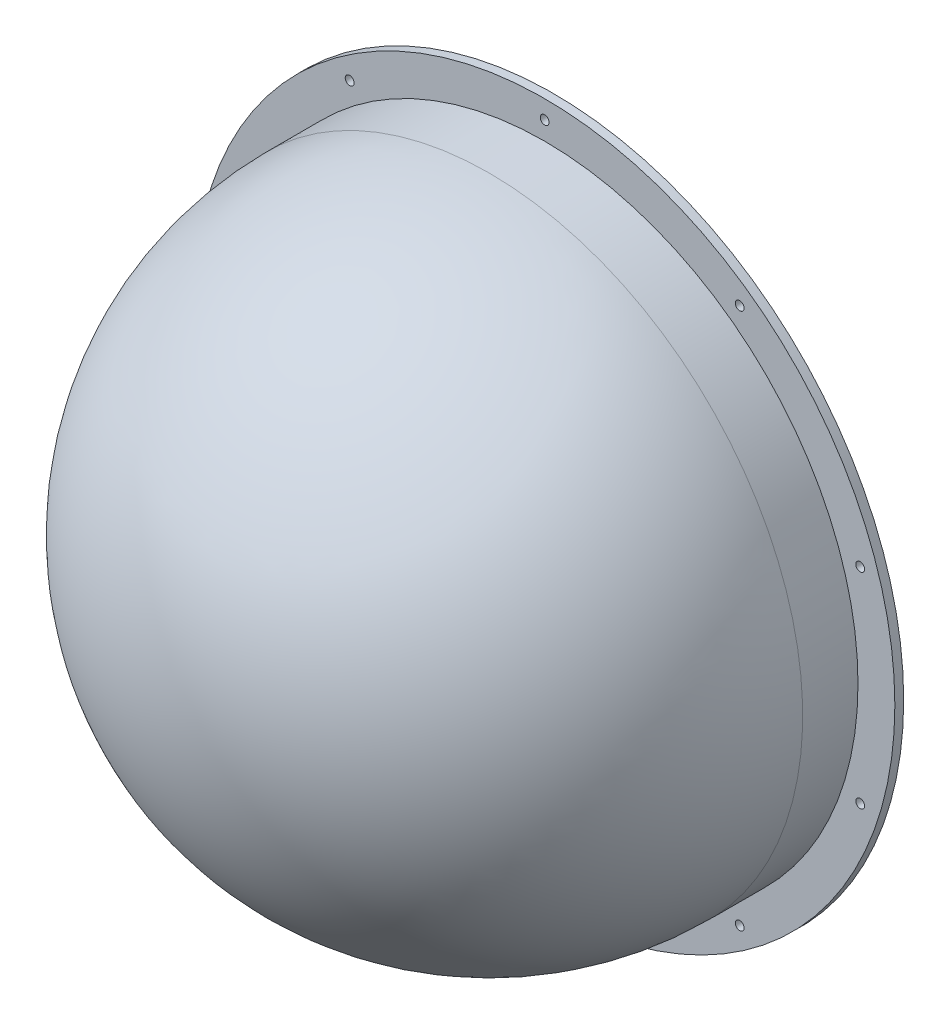
ISO-10303-21;
HEADER;
FILE_DESCRIPTION(('STEP AP214'),'2;1');
FILE_NAME('part.step','',(''),(''),'','','');
FILE_SCHEMA(('AUTOMOTIVE_DESIGN { 1 0 10303 214 1 1 1 1 }'));
ENDSEC;
DATA;
#1=APPLICATION_CONTEXT('core data for automotive mechanical design processes');
#2=APPLICATION_PROTOCOL_DEFINITION('international standard','automotive_design',2000,#1);
#3=PRODUCT_CONTEXT('',#1,'mechanical');
#4=PRODUCT('Part','Part','',(#3));
#5=PRODUCT_RELATED_PRODUCT_CATEGORY('part','',(#4));
#6=PRODUCT_DEFINITION_FORMATION('','',#4);
#7=PRODUCT_DEFINITION_CONTEXT('part definition',#1,'design');
#8=PRODUCT_DEFINITION('design','',#6,#7);
#9=PRODUCT_DEFINITION_SHAPE('','',#8);
#10=(LENGTH_UNIT() NAMED_UNIT(*) SI_UNIT(.MILLI.,.METRE.));
#11=(NAMED_UNIT(*) PLANE_ANGLE_UNIT() SI_UNIT($,.RADIAN.));
#12=(NAMED_UNIT(*) SI_UNIT($,.STERADIAN.) SOLID_ANGLE_UNIT());
#13=UNCERTAINTY_MEASURE_WITH_UNIT(LENGTH_MEASURE(1.E-05),#10,'distance_accuracy_value','');
#14=(GEOMETRIC_REPRESENTATION_CONTEXT(3) GLOBAL_UNCERTAINTY_ASSIGNED_CONTEXT((#13)) GLOBAL_UNIT_ASSIGNED_CONTEXT((#10,
#11,#12)) REPRESENTATION_CONTEXT('',''));
#15=CARTESIAN_POINT('',(0.,0.,0.));
#16=DIRECTION('',(0.,0.,1.));
#17=DIRECTION('',(1.,0.,0.));
#18=AXIS2_PLACEMENT_3D('',#15,#16,#17);
#19=CARTESIAN_POINT('',(0.,0.,12.));
#20=DIRECTION('',(0.,0.,1.));
#21=DIRECTION('',(1.,0.,0.));
#22=AXIS2_PLACEMENT_3D('',#19,#20,#21);
#23=PLANE('',#22);
#24=CARTESIAN_POINT('',(0.,0.,12.));
#25=DIRECTION('',(0.,0.,1.));
#26=DIRECTION('',(1.,0.,0.));
#27=AXIS2_PLACEMENT_3D('',#24,#25,#26);
#28=CIRCLE('',#27,425.);
#29=CARTESIAN_POINT('',(425.,0.,12.));
#30=VERTEX_POINT('',#29);
#31=EDGE_CURVE('E10',#30,#30,#28,.T.);
#32=ORIENTED_EDGE('',*,*,#31,.F.);
#33=EDGE_LOOP('',(#32));
#34=FACE_BOUND('',#33,.T.);
#35=CARTESIAN_POINT('',(-427.975432332819,139.057647468726,12.));
#36=DIRECTION('',(0.,0.,1.));
#37=DIRECTION('',(1.,0.,0.));
#38=AXIS2_PLACEMENT_3D('',#35,#36,#37);
#39=CIRCLE('',#38,5.99999999999999);
#40=CARTESIAN_POINT('',(-421.975432332819,139.057647468726,12.));
#41=VERTEX_POINT('',#40);
#42=EDGE_CURVE('E98',#41,#41,#39,.T.);
#43=ORIENTED_EDGE('',*,*,#42,.F.);
#44=EDGE_LOOP('',(#43));
#45=FACE_BOUND('',#44,.T.);
#46=CARTESIAN_POINT('',(-264.503363531613,-364.057647468727,12.));
#47=DIRECTION('',(0.,0.,1.));
#48=DIRECTION('',(1.,0.,0.));
#49=AXIS2_PLACEMENT_3D('',#46,#47,#48);
#50=CIRCLE('',#49,5.99999999999999);
#51=CARTESIAN_POINT('',(-258.503363531613,-364.057647468727,12.));
#52=VERTEX_POINT('',#51);
#53=EDGE_CURVE('E86',#52,#52,#50,.T.);
#54=ORIENTED_EDGE('',*,*,#53,.F.);
#55=EDGE_LOOP('',(#54));
#56=FACE_BOUND('',#55,.T.);
#57=CARTESIAN_POINT('',(264.503363531613,-364.057647468727,12.));
#58=DIRECTION('',(0.,0.,1.));
#59=DIRECTION('',(1.,0.,0.));
#60=AXIS2_PLACEMENT_3D('',#57,#58,#59);
#61=CIRCLE('',#60,5.99999999999999);
#62=CARTESIAN_POINT('',(270.503363531613,-364.057647468727,12.));
#63=VERTEX_POINT('',#62);
#64=EDGE_CURVE('E74',#63,#63,#61,.T.);
#65=ORIENTED_EDGE('',*,*,#64,.F.);
#66=EDGE_LOOP('',(#65));
#67=FACE_BOUND('',#66,.T.);
#68=CARTESIAN_POINT('',(427.975432332819,139.057647468726,12.));
#69=DIRECTION('',(0.,0.,1.));
#70=DIRECTION('',(1.,0.,0.));
#71=AXIS2_PLACEMENT_3D('',#68,#69,#70);
#72=CIRCLE('',#71,5.99999999999999);
#73=CARTESIAN_POINT('',(433.975432332819,139.057647468726,12.));
#74=VERTEX_POINT('',#73);
#75=EDGE_CURVE('E62',#74,#74,#72,.T.);
#76=ORIENTED_EDGE('',*,*,#75,.F.);
#77=EDGE_LOOP('',(#76));
#78=FACE_BOUND('',#77,.T.);
#79=CARTESIAN_POINT('',(0.,0.,12.));
#80=DIRECTION('',(0.,0.,1.));
#81=DIRECTION('',(1.,0.,0.));
#82=AXIS2_PLACEMENT_3D('',#79,#80,#81);
#83=CIRCLE('',#82,475.);
#84=CARTESIAN_POINT('',(475.,0.,12.));
#85=VERTEX_POINT('',#84);
#86=EDGE_CURVE('E39',#85,#85,#83,.T.);
#87=ORIENTED_EDGE('',*,*,#86,.T.);
#88=EDGE_LOOP('',(#87));
#89=FACE_BOUND('',#88,.T.);
#90=CARTESIAN_POINT('',(0.,450.,12.));
#91=DIRECTION('',(0.,0.,1.));
#92=DIRECTION('',(1.,0.,0.));
#93=AXIS2_PLACEMENT_3D('',#90,#91,#92);
#94=CIRCLE('',#93,6.00000000000001);
#95=CARTESIAN_POINT('',(6.00000000000001,450.,12.));
#96=VERTEX_POINT('',#95);
#97=EDGE_CURVE('E48',#96,#96,#94,.T.);
#98=ORIENTED_EDGE('',*,*,#97,.F.);
#99=EDGE_LOOP('',(#98));
#100=FACE_BOUND('',#99,.T.);
#101=CARTESIAN_POINT('',(264.503363531613,364.057647468726,12.));
#102=DIRECTION('',(0.,0.,1.));
#103=DIRECTION('',(1.,0.,0.));
#104=AXIS2_PLACEMENT_3D('',#101,#102,#103);
#105=CIRCLE('',#104,5.99999999999999);
#106=CARTESIAN_POINT('',(270.503363531613,364.057647468726,12.));
#107=VERTEX_POINT('',#106);
#108=EDGE_CURVE('E58',#107,#107,#105,.T.);
#109=ORIENTED_EDGE('',*,*,#108,.F.);
#110=EDGE_LOOP('',(#109));
#111=FACE_BOUND('',#110,.T.);
#112=CARTESIAN_POINT('',(427.97543233282,-139.057647468727,12.));
#113=DIRECTION('',(0.,0.,1.));
#114=DIRECTION('',(1.,0.,0.));
#115=AXIS2_PLACEMENT_3D('',#112,#113,#114);
#116=CIRCLE('',#115,5.99999999999999);
#117=CARTESIAN_POINT('',(433.97543233282,-139.057647468727,12.));
#118=VERTEX_POINT('',#117);
#119=EDGE_CURVE('E68',#118,#118,#116,.T.);
#120=ORIENTED_EDGE('',*,*,#119,.F.);
#121=EDGE_LOOP('',(#120));
#122=FACE_BOUND('',#121,.T.);
#123=CARTESIAN_POINT('',(2.59383141282199E-13,-450.000000000001,12.));
#124=DIRECTION('',(0.,0.,1.));
#125=DIRECTION('',(1.,0.,0.));
#126=AXIS2_PLACEMENT_3D('',#123,#124,#125);
#127=CIRCLE('',#126,6.00000000000001);
#128=CARTESIAN_POINT('',(6.00000000000027,-450.000000000001,12.));
#129=VERTEX_POINT('',#128);
#130=EDGE_CURVE('E80',#129,#129,#127,.T.);
#131=ORIENTED_EDGE('',*,*,#130,.F.);
#132=EDGE_LOOP('',(#131));
#133=FACE_BOUND('',#132,.T.);
#134=CARTESIAN_POINT('',(-427.975432332819,-139.057647468727,12.));
#135=DIRECTION('',(0.,0.,1.));
#136=DIRECTION('',(1.,0.,0.));
#137=AXIS2_PLACEMENT_3D('',#134,#135,#136);
#138=CIRCLE('',#137,5.99999999999999);
#139=CARTESIAN_POINT('',(-421.975432332819,-139.057647468727,12.));
#140=VERTEX_POINT('',#139);
#141=EDGE_CURVE('E92',#140,#140,#138,.T.);
#142=ORIENTED_EDGE('',*,*,#141,.F.);
#143=EDGE_LOOP('',(#142));
#144=FACE_BOUND('',#143,.T.);
#145=CARTESIAN_POINT('',(-264.503363531613,364.057647468726,12.));
#146=DIRECTION('',(0.,0.,1.));
#147=DIRECTION('',(1.,0.,0.));
#148=AXIS2_PLACEMENT_3D('',#145,#146,#147);
#149=CIRCLE('',#148,5.99999999999999);
#150=CARTESIAN_POINT('',(-258.503363531613,364.057647468726,12.));
#151=VERTEX_POINT('',#150);
#152=EDGE_CURVE('E104',#151,#151,#149,.T.);
#153=ORIENTED_EDGE('',*,*,#152,.F.);
#154=EDGE_LOOP('',(#153));
#155=FACE_BOUND('',#154,.T.);
#156=ADVANCED_FACE('F32',(#34,#45,#56,#67,#78,#89,#100,#111,#122,#133,#144,#155),#23,.T.);
#157=CARTESIAN_POINT('',(0.,0.,0.));
#158=DIRECTION('',(0.,0.,1.));
#159=DIRECTION('',(1.,0.,0.));
#160=AXIS2_PLACEMENT_3D('',#157,#158,#159);
#161=PLANE('',#160);
#162=CARTESIAN_POINT('',(0.,0.,0.));
#163=DIRECTION('',(0.,0.,1.));
#164=DIRECTION('',(1.,0.,0.));
#165=AXIS2_PLACEMENT_3D('',#162,#163,#164);
#166=CIRCLE('',#165,475.);
#167=CARTESIAN_POINT('',(475.,0.,0.));
#168=VERTEX_POINT('',#167);
#169=EDGE_CURVE('E43',#168,#168,#166,.T.);
#170=ORIENTED_EDGE('',*,*,#169,.F.);
#171=EDGE_LOOP('',(#170));
#172=FACE_BOUND('',#171,.T.);
#173=CARTESIAN_POINT('',(0.,450.,0.));
#174=DIRECTION('',(0.,0.,1.));
#175=DIRECTION('',(1.,0.,0.));
#176=AXIS2_PLACEMENT_3D('',#173,#174,#175);
#177=CIRCLE('',#176,6.00000000000001);
#178=CARTESIAN_POINT('',(6.00000000000001,450.,0.));
#179=VERTEX_POINT('',#178);
#180=EDGE_CURVE('E50',#179,#179,#177,.T.);
#181=ORIENTED_EDGE('',*,*,#180,.T.);
#182=EDGE_LOOP('',(#181));
#183=FACE_BOUND('',#182,.T.);
#184=CARTESIAN_POINT('',(0.,0.,0.));
#185=DIRECTION('',(0.,0.,1.));
#186=DIRECTION('',(1.,0.,0.));
#187=AXIS2_PLACEMENT_3D('',#184,#185,#186);
#188=CIRCLE('',#187,419.);
#189=CARTESIAN_POINT('',(419.,0.,0.));
#190=VERTEX_POINT('',#189);
#191=EDGE_CURVE('E53',#190,#190,#188,.T.);
#192=ORIENTED_EDGE('',*,*,#191,.T.);
#193=EDGE_LOOP('',(#192));
#194=FACE_BOUND('',#193,.T.);
#195=CARTESIAN_POINT('',(264.503363531613,364.057647468726,0.));
#196=DIRECTION('',(0.,0.,1.));
#197=DIRECTION('',(1.,0.,0.));
#198=AXIS2_PLACEMENT_3D('',#195,#196,#197);
#199=CIRCLE('',#198,5.99999999999999);
#200=CARTESIAN_POINT('',(270.503363531613,364.057647468726,0.));
#201=VERTEX_POINT('',#200);
#202=EDGE_CURVE('E59',#201,#201,#199,.T.);
#203=ORIENTED_EDGE('',*,*,#202,.T.);
#204=EDGE_LOOP('',(#203));
#205=FACE_BOUND('',#204,.T.);
#206=CARTESIAN_POINT('',(427.975432332819,139.057647468726,0.));
#207=DIRECTION('',(0.,0.,1.));
#208=DIRECTION('',(1.,0.,0.));
#209=AXIS2_PLACEMENT_3D('',#206,#207,#208);
#210=CIRCLE('',#209,5.99999999999999);
#211=CARTESIAN_POINT('',(433.975432332819,139.057647468726,0.));
#212=VERTEX_POINT('',#211);
#213=EDGE_CURVE('E65',#212,#212,#210,.T.);
#214=ORIENTED_EDGE('',*,*,#213,.T.);
#215=EDGE_LOOP('',(#214));
#216=FACE_BOUND('',#215,.T.);
#217=CARTESIAN_POINT('',(427.97543233282,-139.057647468727,0.));
#218=DIRECTION('',(0.,0.,1.));
#219=DIRECTION('',(1.,0.,0.));
#220=AXIS2_PLACEMENT_3D('',#217,#218,#219);
#221=CIRCLE('',#220,5.99999999999999);
#222=CARTESIAN_POINT('',(433.97543233282,-139.057647468727,0.));
#223=VERTEX_POINT('',#222);
#224=EDGE_CURVE('E71',#223,#223,#221,.T.);
#225=ORIENTED_EDGE('',*,*,#224,.T.);
#226=EDGE_LOOP('',(#225));
#227=FACE_BOUND('',#226,.T.);
#228=CARTESIAN_POINT('',(264.503363531613,-364.057647468727,0.));
#229=DIRECTION('',(0.,0.,1.));
#230=DIRECTION('',(1.,0.,0.));
#231=AXIS2_PLACEMENT_3D('',#228,#229,#230);
#232=CIRCLE('',#231,5.99999999999999);
#233=CARTESIAN_POINT('',(270.503363531613,-364.057647468727,0.));
#234=VERTEX_POINT('',#233);
#235=EDGE_CURVE('E77',#234,#234,#232,.T.);
#236=ORIENTED_EDGE('',*,*,#235,.T.);
#237=EDGE_LOOP('',(#236));
#238=FACE_BOUND('',#237,.T.);
#239=CARTESIAN_POINT('',(2.59383141282199E-13,-450.000000000001,0.));
#240=DIRECTION('',(0.,0.,1.));
#241=DIRECTION('',(1.,0.,0.));
#242=AXIS2_PLACEMENT_3D('',#239,#240,#241);
#243=CIRCLE('',#242,6.00000000000001);
#244=CARTESIAN_POINT('',(6.00000000000027,-450.000000000001,0.));
#245=VERTEX_POINT('',#244);
#246=EDGE_CURVE('E83',#245,#245,#243,.T.);
#247=ORIENTED_EDGE('',*,*,#246,.T.);
#248=EDGE_LOOP('',(#247));
#249=FACE_BOUND('',#248,.T.);
#250=CARTESIAN_POINT('',(-264.503363531613,-364.057647468727,0.));
#251=DIRECTION('',(0.,0.,1.));
#252=DIRECTION('',(1.,0.,0.));
#253=AXIS2_PLACEMENT_3D('',#250,#251,#252);
#254=CIRCLE('',#253,5.99999999999999);
#255=CARTESIAN_POINT('',(-258.503363531613,-364.057647468727,0.));
#256=VERTEX_POINT('',#255);
#257=EDGE_CURVE('E89',#256,#256,#254,.T.);
#258=ORIENTED_EDGE('',*,*,#257,.T.);
#259=EDGE_LOOP('',(#258));
#260=FACE_BOUND('',#259,.T.);
#261=CARTESIAN_POINT('',(-427.975432332819,-139.057647468727,0.));
#262=DIRECTION('',(0.,0.,1.));
#263=DIRECTION('',(1.,0.,0.));
#264=AXIS2_PLACEMENT_3D('',#261,#262,#263);
#265=CIRCLE('',#264,5.99999999999999);
#266=CARTESIAN_POINT('',(-421.975432332819,-139.057647468727,0.));
#267=VERTEX_POINT('',#266);
#268=EDGE_CURVE('E95',#267,#267,#265,.T.);
#269=ORIENTED_EDGE('',*,*,#268,.T.);
#270=EDGE_LOOP('',(#269));
#271=FACE_BOUND('',#270,.T.);
#272=CARTESIAN_POINT('',(-427.975432332819,139.057647468726,0.));
#273=DIRECTION('',(0.,0.,1.));
#274=DIRECTION('',(1.,0.,0.));
#275=AXIS2_PLACEMENT_3D('',#272,#273,#274);
#276=CIRCLE('',#275,5.99999999999999);
#277=CARTESIAN_POINT('',(-421.975432332819,139.057647468726,0.));
#278=VERTEX_POINT('',#277);
#279=EDGE_CURVE('E101',#278,#278,#276,.T.);
#280=ORIENTED_EDGE('',*,*,#279,.T.);
#281=EDGE_LOOP('',(#280));
#282=FACE_BOUND('',#281,.T.);
#283=CARTESIAN_POINT('',(-264.503363531613,364.057647468726,0.));
#284=DIRECTION('',(0.,0.,1.));
#285=DIRECTION('',(1.,0.,0.));
#286=AXIS2_PLACEMENT_3D('',#283,#284,#285);
#287=CIRCLE('',#286,5.99999999999999);
#288=CARTESIAN_POINT('',(-258.503363531613,364.057647468726,0.));
#289=VERTEX_POINT('',#288);
#290=EDGE_CURVE('E107',#289,#289,#287,.T.);
#291=ORIENTED_EDGE('',*,*,#290,.T.);
#292=EDGE_LOOP('',(#291));
#293=FACE_BOUND('',#292,.T.);
#294=ADVANCED_FACE('F138',(#172,#183,#194,#205,#216,#227,#238,#249,#260,#271,#282,#293),#161,.F.);
#295=CARTESIAN_POINT('',(0.,0.,12.));
#296=DIRECTION('',(0.,0.,-1.));
#297=DIRECTION('',(-1.,0.,0.));
#298=AXIS2_PLACEMENT_3D('',#295,#296,#297);
#299=CYLINDRICAL_SURFACE('',#298,475.);
#300=ORIENTED_EDGE('',*,*,#86,.F.);
#301=EDGE_LOOP('',(#300));
#302=FACE_BOUND('',#301,.T.);
#303=ORIENTED_EDGE('',*,*,#169,.T.);
#304=EDGE_LOOP('',(#303));
#305=FACE_BOUND('',#304,.T.);
#306=ADVANCED_FACE('F34',(#302,#305),#299,.T.);
#307=CARTESIAN_POINT('',(0.,450.,12.));
#308=DIRECTION('',(0.,0.,-1.));
#309=DIRECTION('',(-1.,0.,0.));
#310=AXIS2_PLACEMENT_3D('',#307,#308,#309);
#311=CYLINDRICAL_SURFACE('',#310,6.00000000000001);
#312=ORIENTED_EDGE('',*,*,#97,.T.);
#313=EDGE_LOOP('',(#312));
#314=FACE_BOUND('',#313,.T.);
#315=ORIENTED_EDGE('',*,*,#180,.F.);
#316=EDGE_LOOP('',(#315));
#317=FACE_BOUND('',#316,.T.);
#318=ADVANCED_FACE('F124',(#314,#317),#311,.F.);
#319=CARTESIAN_POINT('',(0.,0.,12.));
#320=DIRECTION('',(0.,0.,-1.));
#321=DIRECTION('',(-1.,0.,0.));
#322=AXIS2_PLACEMENT_3D('',#319,#320,#321);
#323=CYLINDRICAL_SURFACE('',#322,419.);
#324=ORIENTED_EDGE('',*,*,#191,.F.);
#325=EDGE_LOOP('',(#324));
#326=FACE_BOUND('',#325,.T.);
#327=CARTESIAN_POINT('',(0.,0.,86.9999999999999));
#328=DIRECTION('',(0.,0.,-1.));
#329=DIRECTION('',(0.,1.,0.));
#330=AXIS2_PLACEMENT_3D('',#327,#328,#329);
#331=CIRCLE('',#330,419.);
#332=CARTESIAN_POINT('',(0.,419.,87.0000000000001));
#333=VERTEX_POINT('',#332);
#334=EDGE_CURVE('E115',#333,#333,#331,.T.);
#335=ORIENTED_EDGE('',*,*,#334,.F.);
#336=EDGE_LOOP('',(#335));
#337=FACE_BOUND('',#336,.T.);
#338=ADVANCED_FACE('F121',(#326,#337),#323,.F.);
#339=CARTESIAN_POINT('',(264.503363531613,364.057647468726,12.));
#340=DIRECTION('',(0.,0.,-1.));
#341=DIRECTION('',(-1.,0.,0.));
#342=AXIS2_PLACEMENT_3D('',#339,#340,#341);
#343=CYLINDRICAL_SURFACE('',#342,5.99999999999999);
#344=ORIENTED_EDGE('',*,*,#108,.T.);
#345=EDGE_LOOP('',(#344));
#346=FACE_BOUND('',#345,.T.);
#347=ORIENTED_EDGE('',*,*,#202,.F.);
#348=EDGE_LOOP('',(#347));
#349=FACE_BOUND('',#348,.T.);
#350=ADVANCED_FACE('F123',(#346,#349),#343,.F.);
#351=CARTESIAN_POINT('',(427.975432332819,139.057647468726,12.));
#352=DIRECTION('',(0.,0.,-1.));
#353=DIRECTION('',(-1.,0.,0.));
#354=AXIS2_PLACEMENT_3D('',#351,#352,#353);
#355=CYLINDRICAL_SURFACE('',#354,5.99999999999999);
#356=ORIENTED_EDGE('',*,*,#75,.T.);
#357=EDGE_LOOP('',(#356));
#358=FACE_BOUND('',#357,.T.);
#359=ORIENTED_EDGE('',*,*,#213,.F.);
#360=EDGE_LOOP('',(#359));
#361=FACE_BOUND('',#360,.T.);
#362=ADVANCED_FACE('F131',(#358,#361),#355,.F.);
#363=CARTESIAN_POINT('',(427.97543233282,-139.057647468727,12.));
#364=DIRECTION('',(0.,0.,-1.));
#365=DIRECTION('',(-1.,0.,0.));
#366=AXIS2_PLACEMENT_3D('',#363,#364,#365);
#367=CYLINDRICAL_SURFACE('',#366,5.99999999999999);
#368=ORIENTED_EDGE('',*,*,#119,.T.);
#369=EDGE_LOOP('',(#368));
#370=FACE_BOUND('',#369,.T.);
#371=ORIENTED_EDGE('',*,*,#224,.F.);
#372=EDGE_LOOP('',(#371));
#373=FACE_BOUND('',#372,.T.);
#374=ADVANCED_FACE('F199',(#370,#373),#367,.F.);
#375=CARTESIAN_POINT('',(264.503363531613,-364.057647468727,12.));
#376=DIRECTION('',(0.,0.,-1.));
#377=DIRECTION('',(-1.,0.,0.));
#378=AXIS2_PLACEMENT_3D('',#375,#376,#377);
#379=CYLINDRICAL_SURFACE('',#378,5.99999999999999);
#380=ORIENTED_EDGE('',*,*,#64,.T.);
#381=EDGE_LOOP('',(#380));
#382=FACE_BOUND('',#381,.T.);
#383=ORIENTED_EDGE('',*,*,#235,.F.);
#384=EDGE_LOOP('',(#383));
#385=FACE_BOUND('',#384,.T.);
#386=ADVANCED_FACE('F195',(#382,#385),#379,.F.);
#387=CARTESIAN_POINT('',(2.59383141282199E-13,-450.000000000001,12.));
#388=DIRECTION('',(0.,0.,-1.));
#389=DIRECTION('',(-1.,0.,0.));
#390=AXIS2_PLACEMENT_3D('',#387,#388,#389);
#391=CYLINDRICAL_SURFACE('',#390,6.00000000000001);
#392=ORIENTED_EDGE('',*,*,#130,.T.);
#393=EDGE_LOOP('',(#392));
#394=FACE_BOUND('',#393,.T.);
#395=ORIENTED_EDGE('',*,*,#246,.F.);
#396=EDGE_LOOP('',(#395));
#397=FACE_BOUND('',#396,.T.);
#398=ADVANCED_FACE('F191',(#394,#397),#391,.F.);
#399=CARTESIAN_POINT('',(-264.503363531613,-364.057647468727,12.));
#400=DIRECTION('',(0.,0.,-1.));
#401=DIRECTION('',(-1.,0.,0.));
#402=AXIS2_PLACEMENT_3D('',#399,#400,#401);
#403=CYLINDRICAL_SURFACE('',#402,5.99999999999999);
#404=ORIENTED_EDGE('',*,*,#53,.T.);
#405=EDGE_LOOP('',(#404));
#406=FACE_BOUND('',#405,.T.);
#407=ORIENTED_EDGE('',*,*,#257,.F.);
#408=EDGE_LOOP('',(#407));
#409=FACE_BOUND('',#408,.T.);
#410=ADVANCED_FACE('F187',(#406,#409),#403,.F.);
#411=CARTESIAN_POINT('',(-427.975432332819,-139.057647468727,12.));
#412=DIRECTION('',(0.,0.,-1.));
#413=DIRECTION('',(-1.,0.,0.));
#414=AXIS2_PLACEMENT_3D('',#411,#412,#413);
#415=CYLINDRICAL_SURFACE('',#414,5.99999999999999);
#416=ORIENTED_EDGE('',*,*,#141,.T.);
#417=EDGE_LOOP('',(#416));
#418=FACE_BOUND('',#417,.T.);
#419=ORIENTED_EDGE('',*,*,#268,.F.);
#420=EDGE_LOOP('',(#419));
#421=FACE_BOUND('',#420,.T.);
#422=ADVANCED_FACE('F179',(#418,#421),#415,.F.);
#423=CARTESIAN_POINT('',(-427.975432332819,139.057647468726,12.));
#424=DIRECTION('',(0.,0.,-1.));
#425=DIRECTION('',(-1.,0.,0.));
#426=AXIS2_PLACEMENT_3D('',#423,#424,#425);
#427=CYLINDRICAL_SURFACE('',#426,5.99999999999999);
#428=ORIENTED_EDGE('',*,*,#42,.T.);
#429=EDGE_LOOP('',(#428));
#430=FACE_BOUND('',#429,.T.);
#431=ORIENTED_EDGE('',*,*,#279,.F.);
#432=EDGE_LOOP('',(#431));
#433=FACE_BOUND('',#432,.T.);
#434=ADVANCED_FACE('F169',(#430,#433),#427,.F.);
#435=CARTESIAN_POINT('',(-264.503363531613,364.057647468726,12.));
#436=DIRECTION('',(0.,0.,-1.));
#437=DIRECTION('',(-1.,0.,0.));
#438=AXIS2_PLACEMENT_3D('',#435,#436,#437);
#439=CYLINDRICAL_SURFACE('',#438,5.99999999999999);
#440=ORIENTED_EDGE('',*,*,#152,.T.);
#441=EDGE_LOOP('',(#440));
#442=FACE_BOUND('',#441,.T.);
#443=ORIENTED_EDGE('',*,*,#290,.F.);
#444=EDGE_LOOP('',(#443));
#445=FACE_BOUND('',#444,.T.);
#446=ADVANCED_FACE('F166',(#442,#445),#439,.F.);
#447=CARTESIAN_POINT('',(0.,0.,87.));
#448=DIRECTION('',(0.,0.,-1.));
#449=DIRECTION('',(0.,1.,0.));
#450=AXIS2_PLACEMENT_3D('',#447,#448,#449);
#451=SPHERICAL_SURFACE('',#450,419.);
#452=ORIENTED_EDGE('',*,*,#334,.T.);
#453=EDGE_LOOP('',(#452));
#454=FACE_BOUND('',#453,.T.);
#455=ADVANCED_FACE('F119',(#454),#451,.F.);
#456=CARTESIAN_POINT('',(0.,0.,12.));
#457=DIRECTION('',(0.,0.,-1.));
#458=DIRECTION('',(0.,1.,0.));
#459=AXIS2_PLACEMENT_3D('',#456,#457,#458);
#460=CYLINDRICAL_SURFACE('',#459,425.);
#461=CARTESIAN_POINT('',(0.,0.,86.9999999999999));
#462=DIRECTION('',(0.,0.,-1.));
#463=DIRECTION('',(0.,1.,0.));
#464=AXIS2_PLACEMENT_3D('',#461,#462,#463);
#465=CIRCLE('',#464,425.);
#466=CARTESIAN_POINT('',(0.,425.,87.0000000000001));
#467=VERTEX_POINT('',#466);
#468=EDGE_CURVE('E110',#467,#467,#465,.T.);
#469=ORIENTED_EDGE('',*,*,#468,.T.);
#470=EDGE_LOOP('',(#469));
#471=FACE_BOUND('',#470,.T.);
#472=ORIENTED_EDGE('',*,*,#31,.T.);
#473=EDGE_LOOP('',(#472));
#474=FACE_BOUND('',#473,.T.);
#475=ADVANCED_FACE('F177',(#471,#474),#460,.T.);
#476=CARTESIAN_POINT('',(0.,0.,87.));
#477=DIRECTION('',(0.,0.,-1.));
#478=DIRECTION('',(0.,1.,0.));
#479=AXIS2_PLACEMENT_3D('',#476,#477,#478);
#480=SPHERICAL_SURFACE('',#479,425.);
#481=ORIENTED_EDGE('',*,*,#468,.F.);
#482=EDGE_LOOP('',(#481));
#483=FACE_BOUND('',#482,.T.);
#484=ADVANCED_FACE('F285',(#483),#480,.T.);
#485=CLOSED_SHELL('',(#156,#294,#306,#318,#338,#350,#362,#374,#386,#398,#410,#422,#434,#446,
#455,#475,#484));
#486=MANIFOLD_SOLID_BREP('B2',#485);
#487=ADVANCED_BREP_SHAPE_REPRESENTATION('',(#18,#486),#14);
#488=SHAPE_DEFINITION_REPRESENTATION(#9,#487);
ENDSEC;
END-ISO-10303-21;
